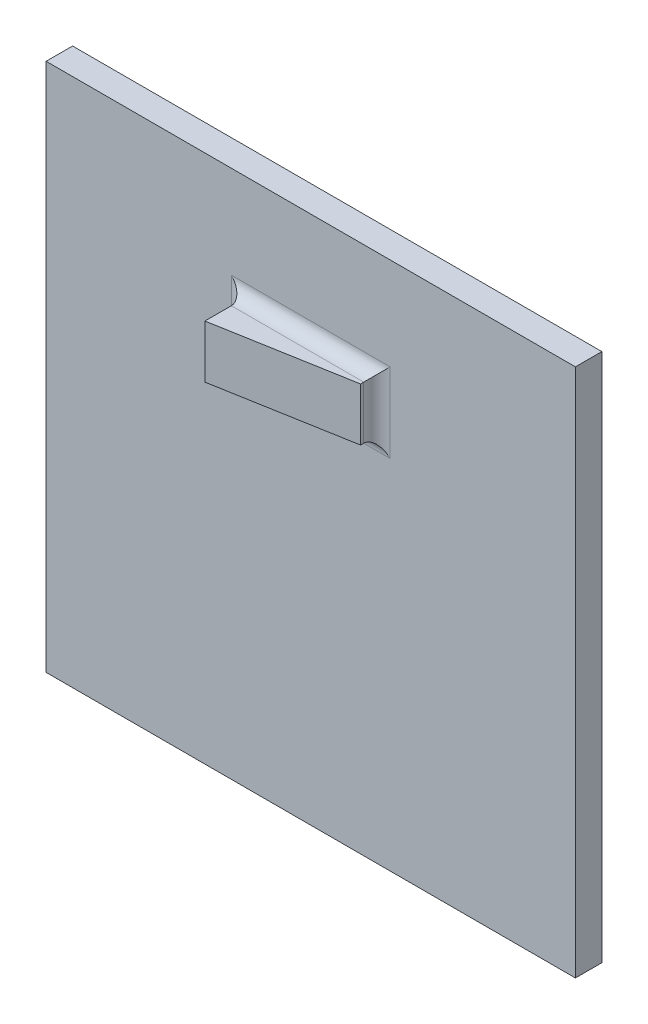
ISO-10303-21;
HEADER;
FILE_DESCRIPTION(('STEP AP214'),'2;1');
FILE_NAME('part.step','',(''),(''),'','','');
FILE_SCHEMA(('AUTOMOTIVE_DESIGN { 1 0 10303 214 1 1 1 1 }'));
ENDSEC;
DATA;
#1=APPLICATION_CONTEXT('core data for automotive mechanical design processes');
#2=APPLICATION_PROTOCOL_DEFINITION('international standard','automotive_design',2000,#1);
#3=PRODUCT_CONTEXT('',#1,'mechanical');
#4=PRODUCT('Part','Part','',(#3));
#5=PRODUCT_RELATED_PRODUCT_CATEGORY('part','',(#4));
#6=PRODUCT_DEFINITION_FORMATION('','',#4);
#7=PRODUCT_DEFINITION_CONTEXT('part definition',#1,'design');
#8=PRODUCT_DEFINITION('design','',#6,#7);
#9=PRODUCT_DEFINITION_SHAPE('','',#8);
#10=(LENGTH_UNIT() NAMED_UNIT(*) SI_UNIT(.MILLI.,.METRE.));
#11=(NAMED_UNIT(*) PLANE_ANGLE_UNIT() SI_UNIT($,.RADIAN.));
#12=(NAMED_UNIT(*) SI_UNIT($,.STERADIAN.) SOLID_ANGLE_UNIT());
#13=UNCERTAINTY_MEASURE_WITH_UNIT(LENGTH_MEASURE(1.E-05),#10,'distance_accuracy_value','');
#14=(GEOMETRIC_REPRESENTATION_CONTEXT(3) GLOBAL_UNCERTAINTY_ASSIGNED_CONTEXT((#13)) GLOBAL_UNIT_ASSIGNED_CONTEXT((#10,
#11,#12)) REPRESENTATION_CONTEXT('',''));
#15=CARTESIAN_POINT('',(0.,0.,0.));
#16=DIRECTION('',(0.,0.,1.));
#17=DIRECTION('',(1.,0.,0.));
#18=AXIS2_PLACEMENT_3D('',#15,#16,#17);
#19=CARTESIAN_POINT('',(20.,10.,2.));
#20=DIRECTION('',(-1.,0.,0.));
#21=DIRECTION('',(0.,-1.,0.));
#22=AXIS2_PLACEMENT_3D('',#19,#20,#21);
#23=PLANE('',#22);
#24=DIRECTION('',(0.,1.,0.));
#25=VECTOR('',#24,1.);
#26=CARTESIAN_POINT('',(20.,10.,0.));
#27=LINE('',#26,#25);
#28=CARTESIAN_POINT('',(20.,-30.,0.));
#29=VERTEX_POINT('',#28);
#30=CARTESIAN_POINT('',(20.,10.,0.));
#31=VERTEX_POINT('',#30);
#32=EDGE_CURVE('E141',#29,#31,#27,.T.);
#33=ORIENTED_EDGE('',*,*,#32,.T.);
#34=DIRECTION('',(0.,0.,-1.));
#35=VECTOR('',#34,1.);
#36=CARTESIAN_POINT('',(20.,10.,2.));
#37=LINE('',#36,#35);
#38=CARTESIAN_POINT('',(20.,10.,2.));
#39=VERTEX_POINT('',#38);
#40=EDGE_CURVE('E203',#39,#31,#37,.T.);
#41=ORIENTED_EDGE('',*,*,#40,.F.);
#42=DIRECTION('',(0.,1.,0.));
#43=VECTOR('',#42,1.);
#44=CARTESIAN_POINT('',(20.,10.,2.));
#45=LINE('',#44,#43);
#46=CARTESIAN_POINT('',(20.,-30.,2.));
#47=VERTEX_POINT('',#46);
#48=EDGE_CURVE('E134',#47,#39,#45,.T.);
#49=ORIENTED_EDGE('',*,*,#48,.F.);
#50=DIRECTION('',(0.,0.,1.));
#51=VECTOR('',#50,1.);
#52=CARTESIAN_POINT('',(20.,-30.,0.));
#53=LINE('',#52,#51);
#54=EDGE_CURVE('E146',#29,#47,#53,.T.);
#55=ORIENTED_EDGE('',*,*,#54,.F.);
#56=EDGE_LOOP('',(#33,#41,#49,#55));
#57=FACE_BOUND('',#56,.T.);
#58=ADVANCED_FACE('F42',(#57),#23,.F.);
#59=CARTESIAN_POINT('',(-20.,10.,2.));
#60=DIRECTION('',(0.,-1.,0.));
#61=DIRECTION('',(0.,0.,-1.));
#62=AXIS2_PLACEMENT_3D('',#59,#60,#61);
#63=PLANE('',#62);
#64=DIRECTION('',(-1.,0.,0.));
#65=VECTOR('',#64,1.);
#66=CARTESIAN_POINT('',(-20.,10.,0.));
#67=LINE('',#66,#65);
#68=CARTESIAN_POINT('',(-20.,10.,0.));
#69=VERTEX_POINT('',#68);
#70=EDGE_CURVE('E135',#31,#69,#67,.T.);
#71=ORIENTED_EDGE('',*,*,#70,.T.);
#72=DIRECTION('',(0.,0.,-1.));
#73=VECTOR('',#72,1.);
#74=CARTESIAN_POINT('',(-20.,10.,2.));
#75=LINE('',#74,#73);
#76=CARTESIAN_POINT('',(-20.,10.,2.));
#77=VERTEX_POINT('',#76);
#78=EDGE_CURVE('E131',#77,#69,#75,.T.);
#79=ORIENTED_EDGE('',*,*,#78,.F.);
#80=DIRECTION('',(-1.,0.,0.));
#81=VECTOR('',#80,1.);
#82=CARTESIAN_POINT('',(-20.,10.,2.));
#83=LINE('',#82,#81);
#84=EDGE_CURVE('E191',#39,#77,#83,.T.);
#85=ORIENTED_EDGE('',*,*,#84,.F.);
#86=ORIENTED_EDGE('',*,*,#40,.T.);
#87=EDGE_LOOP('',(#71,#79,#85,#86));
#88=FACE_BOUND('',#87,.T.);
#89=ADVANCED_FACE('F271',(#88),#63,.F.);
#90=CARTESIAN_POINT('',(-20.,10.,2.));
#91=DIRECTION('',(1.,0.,0.));
#92=DIRECTION('',(0.,1.,0.));
#93=AXIS2_PLACEMENT_3D('',#90,#91,#92);
#94=PLANE('',#93);
#95=DIRECTION('',(0.,-1.,0.));
#96=VECTOR('',#95,1.);
#97=CARTESIAN_POINT('',(-20.,10.,0.));
#98=LINE('',#97,#96);
#99=CARTESIAN_POINT('',(-20.,-30.,0.));
#100=VERTEX_POINT('',#99);
#101=EDGE_CURVE('E124',#69,#100,#98,.T.);
#102=ORIENTED_EDGE('',*,*,#101,.T.);
#103=DIRECTION('',(0.,0.,-1.));
#104=VECTOR('',#103,1.);
#105=CARTESIAN_POINT('',(-20.,-30.,2.));
#106=LINE('',#105,#104);
#107=CARTESIAN_POINT('',(-20.,-30.,2.));
#108=VERTEX_POINT('',#107);
#109=EDGE_CURVE('E129',#108,#100,#106,.T.);
#110=ORIENTED_EDGE('',*,*,#109,.F.);
#111=DIRECTION('',(0.,-1.,0.));
#112=VECTOR('',#111,1.);
#113=CARTESIAN_POINT('',(-20.,10.,2.));
#114=LINE('',#113,#112);
#115=EDGE_CURVE('E194',#77,#108,#114,.T.);
#116=ORIENTED_EDGE('',*,*,#115,.F.);
#117=ORIENTED_EDGE('',*,*,#78,.T.);
#118=EDGE_LOOP('',(#102,#110,#116,#117));
#119=FACE_BOUND('',#118,.T.);
#120=ADVANCED_FACE('F126',(#119),#94,.F.);
#121=CARTESIAN_POINT('',(0.,0.,2.));
#122=DIRECTION('',(0.,0.,1.));
#123=DIRECTION('',(1.,0.,0.));
#124=AXIS2_PLACEMENT_3D('',#121,#122,#123);
#125=PLANE('',#124);
#126=DIRECTION('',(-1.,0.,0.));
#127=VECTOR('',#126,1.);
#128=CARTESIAN_POINT('',(0.,3.,2.));
#129=LINE('',#128,#127);
#130=CARTESIAN_POINT('',(-6.,3.,2.));
#131=VERTEX_POINT('',#130);
#132=CARTESIAN_POINT('',(6.,3.,2.));
#133=VERTEX_POINT('',#132);
#134=EDGE_CURVE('E217',#131,#133,#129,.F.);
#135=ORIENTED_EDGE('',*,*,#134,.T.);
#136=DIRECTION('',(0.,1.,0.));
#137=VECTOR('',#136,1.);
#138=CARTESIAN_POINT('',(6.,0.,2.));
#139=LINE('',#138,#137);
#140=CARTESIAN_POINT('',(6.,-3.,2.));
#141=VERTEX_POINT('',#140);
#142=EDGE_CURVE('E220',#133,#141,#139,.F.);
#143=ORIENTED_EDGE('',*,*,#142,.T.);
#144=DIRECTION('',(1.,0.,0.));
#145=VECTOR('',#144,1.);
#146=CARTESIAN_POINT('',(0.,-3.,2.));
#147=LINE('',#146,#145);
#148=CARTESIAN_POINT('',(-6.,-3.,2.));
#149=VERTEX_POINT('',#148);
#150=EDGE_CURVE('E211',#141,#149,#147,.F.);
#151=ORIENTED_EDGE('',*,*,#150,.T.);
#152=DIRECTION('',(0.,-1.,0.));
#153=VECTOR('',#152,1.);
#154=CARTESIAN_POINT('',(-6.,0.,2.));
#155=LINE('',#154,#153);
#156=EDGE_CURVE('E214',#149,#131,#155,.F.);
#157=ORIENTED_EDGE('',*,*,#156,.T.);
#158=EDGE_LOOP('',(#135,#143,#151,#157));
#159=FACE_BOUND('',#158,.T.);
#160=ORIENTED_EDGE('',*,*,#48,.T.);
#161=ORIENTED_EDGE('',*,*,#84,.T.);
#162=ORIENTED_EDGE('',*,*,#115,.T.);
#163=DIRECTION('',(-1.,0.,0.));
#164=VECTOR('',#163,1.);
#165=CARTESIAN_POINT('',(20.,-30.,2.));
#166=LINE('',#165,#164);
#167=EDGE_CURVE('E151',#47,#108,#166,.T.);
#168=ORIENTED_EDGE('',*,*,#167,.F.);
#169=EDGE_LOOP('',(#160,#161,#162,#168));
#170=FACE_BOUND('',#169,.T.);
#171=ADVANCED_FACE('F337',(#159,#170),#125,.T.);
#172=CARTESIAN_POINT('',(0.,0.,0.));
#173=DIRECTION('',(0.,0.,1.));
#174=DIRECTION('',(1.,0.,0.));
#175=AXIS2_PLACEMENT_3D('',#172,#173,#174);
#176=PLANE('',#175);
#177=ORIENTED_EDGE('',*,*,#32,.F.);
#178=DIRECTION('',(1.,0.,0.));
#179=VECTOR('',#178,1.);
#180=CARTESIAN_POINT('',(-20.,-30.,0.));
#181=LINE('',#180,#179);
#182=EDGE_CURVE('E138',#100,#29,#181,.T.);
#183=ORIENTED_EDGE('',*,*,#182,.F.);
#184=ORIENTED_EDGE('',*,*,#101,.F.);
#185=ORIENTED_EDGE('',*,*,#70,.F.);
#186=EDGE_LOOP('',(#177,#183,#184,#185));
#187=FACE_BOUND('',#186,.T.);
#188=ADVANCED_FACE('F139',(#187),#176,.F.);
#189=CARTESIAN_POINT('',(5.,2.,5.));
#190=DIRECTION('',(-1.,0.,0.));
#191=DIRECTION('',(0.,-1.,0.));
#192=AXIS2_PLACEMENT_3D('',#189,#190,#191);
#193=PLANE('',#192);
#194=DIRECTION('',(0.,0.,-1.));
#195=VECTOR('',#194,1.);
#196=CARTESIAN_POINT('',(5.,-2.,5.));
#197=LINE('',#196,#195);
#198=CARTESIAN_POINT('',(5.,-2.,3.23673019291542));
#199=VERTEX_POINT('',#198);
#200=CARTESIAN_POINT('',(5.,-2.,3.));
#201=VERTEX_POINT('',#200);
#202=EDGE_CURVE('E175',#199,#201,#197,.T.);
#203=ORIENTED_EDGE('',*,*,#202,.T.);
#204=DIRECTION('',(0.,1.,0.));
#205=VECTOR('',#204,1.);
#206=CARTESIAN_POINT('',(5.,2.,3.));
#207=LINE('',#206,#205);
#208=CARTESIAN_POINT('',(5.,2.,3.));
#209=VERTEX_POINT('',#208);
#210=EDGE_CURVE('E207',#201,#209,#207,.T.);
#211=ORIENTED_EDGE('',*,*,#210,.T.);
#212=DIRECTION('',(0.,0.,-1.));
#213=VECTOR('',#212,1.);
#214=CARTESIAN_POINT('',(5.,2.,5.));
#215=LINE('',#214,#213);
#216=CARTESIAN_POINT('',(5.,2.,3.23673019291542));
#217=VERTEX_POINT('',#216);
#218=EDGE_CURVE('E185',#217,#209,#215,.T.);
#219=ORIENTED_EDGE('',*,*,#218,.F.);
#220=DIRECTION('',(0.,-1.,0.));
#221=VECTOR('',#220,1.);
#222=CARTESIAN_POINT('',(5.,10.001,3.23673019291542));
#223=LINE('',#222,#221);
#224=EDGE_CURVE('E165',#217,#199,#223,.T.);
#225=ORIENTED_EDGE('',*,*,#224,.T.);
#226=EDGE_LOOP('',(#203,#211,#219,#225));
#227=FACE_BOUND('',#226,.T.);
#228=ADVANCED_FACE('F254',(#227),#193,.F.);
#229=CARTESIAN_POINT('',(-5.,2.,5.));
#230=DIRECTION('',(0.,-1.,0.));
#231=DIRECTION('',(0.,0.,-1.));
#232=AXIS2_PLACEMENT_3D('',#229,#230,#231);
#233=PLANE('',#232);
#234=ORIENTED_EDGE('',*,*,#218,.T.);
#235=DIRECTION('',(-1.,0.,0.));
#236=VECTOR('',#235,1.);
#237=CARTESIAN_POINT('',(-5.,2.,3.));
#238=LINE('',#237,#236);
#239=CARTESIAN_POINT('',(-5.,2.,3.));
#240=VERTEX_POINT('',#239);
#241=EDGE_CURVE('E67',#209,#240,#238,.T.);
#242=ORIENTED_EDGE('',*,*,#241,.T.);
#243=DIRECTION('',(0.,0.,-1.));
#244=VECTOR('',#243,1.);
#245=CARTESIAN_POINT('',(-5.,2.,5.));
#246=LINE('',#245,#244);
#247=CARTESIAN_POINT('',(-5.,2.,5.));
#248=VERTEX_POINT('',#247);
#249=EDGE_CURVE('E182',#248,#240,#246,.T.);
#250=ORIENTED_EDGE('',*,*,#249,.F.);
#251=DIRECTION('',(-0.984807753012209,0.,0.173648177666923));
#252=VECTOR('',#251,1.);
#253=CARTESIAN_POINT('',(-5.,2.,5.));
#254=LINE('',#253,#252);
#255=EDGE_CURVE('E169',#217,#248,#254,.T.);
#256=ORIENTED_EDGE('',*,*,#255,.F.);
#257=EDGE_LOOP('',(#234,#242,#250,#256));
#258=FACE_BOUND('',#257,.T.);
#259=ADVANCED_FACE('F259',(#258),#233,.F.);
#260=CARTESIAN_POINT('',(-5.,2.,5.));
#261=DIRECTION('',(1.,0.,0.));
#262=DIRECTION('',(0.,0.,-1.));
#263=AXIS2_PLACEMENT_3D('',#260,#261,#262);
#264=PLANE('',#263);
#265=ORIENTED_EDGE('',*,*,#249,.T.);
#266=DIRECTION('',(0.,-1.,0.));
#267=VECTOR('',#266,1.);
#268=CARTESIAN_POINT('',(-5.,2.,3.));
#269=LINE('',#268,#267);
#270=CARTESIAN_POINT('',(-5.,-2.,3.));
#271=VERTEX_POINT('',#270);
#272=EDGE_CURVE('E52',#240,#271,#269,.T.);
#273=ORIENTED_EDGE('',*,*,#272,.T.);
#274=DIRECTION('',(0.,0.,-1.));
#275=VECTOR('',#274,1.);
#276=CARTESIAN_POINT('',(-5.,-2.,5.));
#277=LINE('',#276,#275);
#278=CARTESIAN_POINT('',(-5.,-2.,5.));
#279=VERTEX_POINT('',#278);
#280=EDGE_CURVE('E179',#279,#271,#277,.T.);
#281=ORIENTED_EDGE('',*,*,#280,.F.);
#282=DIRECTION('',(0.,-1.,0.));
#283=VECTOR('',#282,1.);
#284=CARTESIAN_POINT('',(-5.,2.,5.));
#285=LINE('',#284,#283);
#286=EDGE_CURVE('E172',#248,#279,#285,.T.);
#287=ORIENTED_EDGE('',*,*,#286,.F.);
#288=EDGE_LOOP('',(#265,#273,#281,#287));
#289=FACE_BOUND('',#288,.T.);
#290=ADVANCED_FACE('F261',(#289),#264,.F.);
#291=CARTESIAN_POINT('',(-5.,-2.,5.));
#292=DIRECTION('',(0.,1.,0.));
#293=DIRECTION('',(0.,0.,1.));
#294=AXIS2_PLACEMENT_3D('',#291,#292,#293);
#295=PLANE('',#294);
#296=ORIENTED_EDGE('',*,*,#280,.T.);
#297=DIRECTION('',(1.,0.,0.));
#298=VECTOR('',#297,1.);
#299=CARTESIAN_POINT('',(-5.,-2.,3.));
#300=LINE('',#299,#298);
#301=EDGE_CURVE('E11',#271,#201,#300,.T.);
#302=ORIENTED_EDGE('',*,*,#301,.T.);
#303=ORIENTED_EDGE('',*,*,#202,.F.);
#304=DIRECTION('',(0.984807753012209,0.,-0.173648177666923));
#305=VECTOR('',#304,1.);
#306=CARTESIAN_POINT('',(-5.,-2.,5.));
#307=LINE('',#306,#305);
#308=EDGE_CURVE('E162',#279,#199,#307,.T.);
#309=ORIENTED_EDGE('',*,*,#308,.F.);
#310=EDGE_LOOP('',(#296,#302,#303,#309));
#311=FACE_BOUND('',#310,.T.);
#312=ADVANCED_FACE('F251',(#311),#295,.F.);
#313=CARTESIAN_POINT('',(-5.,10.001,5.));
#314=DIRECTION('',(-0.173648177666923,0.,-0.984807753012209));
#315=DIRECTION('',(-0.984807753012209,0.,0.173648177666923));
#316=AXIS2_PLACEMENT_3D('',#313,#314,#315);
#317=PLANE('',#316);
#318=ORIENTED_EDGE('',*,*,#255,.T.);
#319=ORIENTED_EDGE('',*,*,#286,.T.);
#320=ORIENTED_EDGE('',*,*,#308,.T.);
#321=ORIENTED_EDGE('',*,*,#224,.F.);
#322=EDGE_LOOP('',(#318,#319,#320,#321));
#323=FACE_BOUND('',#322,.T.);
#324=ADVANCED_FACE('F258',(#323),#317,.F.);
#325=CARTESIAN_POINT('',(0.,-30.,0.));
#326=DIRECTION('',(0.,-1.,0.));
#327=DIRECTION('',(0.,0.,-1.));
#328=AXIS2_PLACEMENT_3D('',#325,#326,#327);
#329=PLANE('',#328);
#330=ORIENTED_EDGE('',*,*,#109,.T.);
#331=ORIENTED_EDGE('',*,*,#182,.T.);
#332=ORIENTED_EDGE('',*,*,#54,.T.);
#333=ORIENTED_EDGE('',*,*,#167,.T.);
#334=EDGE_LOOP('',(#330,#331,#332,#333));
#335=FACE_BOUND('',#334,.T.);
#336=ADVANCED_FACE('F149',(#335),#329,.T.);
#337=CARTESIAN_POINT('',(-6.,2.,3.));
#338=DIRECTION('',(0.,-1.,0.));
#339=DIRECTION('',(0.,0.,-1.));
#340=AXIS2_PLACEMENT_3D('',#337,#338,#339);
#341=CYLINDRICAL_SURFACE('',#340,1.);
#342=CARTESIAN_POINT('',(-6.,3.,3.));
#343=DIRECTION('',(-0.707106781186547,-0.707106781186547,0.));
#344=DIRECTION('',(0.707106781186547,-0.707106781186547,0.));
#345=AXIS2_PLACEMENT_3D('',#342,#343,#344);
#346=ELLIPSE('',#345,1.41421356237309,1.);
#347=EDGE_CURVE('E156',#131,#240,#346,.T.);
#348=ORIENTED_EDGE('',*,*,#347,.F.);
#349=ORIENTED_EDGE('',*,*,#156,.F.);
#350=CARTESIAN_POINT('',(-6.,-3.,3.));
#351=DIRECTION('',(0.707106781186547,-0.707106781186547,0.));
#352=DIRECTION('',(0.707106781186547,0.707106781186547,0.));
#353=AXIS2_PLACEMENT_3D('',#350,#351,#352);
#354=ELLIPSE('',#353,1.41421356237309,1.);
#355=EDGE_CURVE('E46',#271,#149,#354,.F.);
#356=ORIENTED_EDGE('',*,*,#355,.F.);
#357=ORIENTED_EDGE('',*,*,#272,.F.);
#358=EDGE_LOOP('',(#348,#349,#356,#357));
#359=FACE_BOUND('',#358,.T.);
#360=ADVANCED_FACE('F44',(#359),#341,.F.);
#361=CARTESIAN_POINT('',(-5.,-3.,3.));
#362=DIRECTION('',(1.,0.,0.));
#363=DIRECTION('',(0.,0.,-1.));
#364=AXIS2_PLACEMENT_3D('',#361,#362,#363);
#365=CYLINDRICAL_SURFACE('',#364,1.);
#366=ORIENTED_EDGE('',*,*,#355,.T.);
#367=ORIENTED_EDGE('',*,*,#150,.F.);
#368=CARTESIAN_POINT('',(6.,-3.,3.));
#369=DIRECTION('',(0.707106781186547,0.707106781186548,0.));
#370=DIRECTION('',(0.707106781186548,-0.707106781186547,0.));
#371=AXIS2_PLACEMENT_3D('',#368,#369,#370);
#372=ELLIPSE('',#371,1.4142135623731,1.);
#373=EDGE_CURVE('E231',#201,#141,#372,.F.);
#374=ORIENTED_EDGE('',*,*,#373,.F.);
#375=ORIENTED_EDGE('',*,*,#301,.F.);
#376=EDGE_LOOP('',(#366,#367,#374,#375));
#377=FACE_BOUND('',#376,.T.);
#378=ADVANCED_FACE('F247',(#377),#365,.F.);
#379=CARTESIAN_POINT('',(-5.,3.,3.));
#380=DIRECTION('',(-1.,0.,0.));
#381=DIRECTION('',(0.,0.,1.));
#382=AXIS2_PLACEMENT_3D('',#379,#380,#381);
#383=CYLINDRICAL_SURFACE('',#382,1.);
#384=ORIENTED_EDGE('',*,*,#347,.T.);
#385=ORIENTED_EDGE('',*,*,#241,.F.);
#386=CARTESIAN_POINT('',(6.,3.,3.));
#387=DIRECTION('',(-0.707106781186548,0.707106781186547,0.));
#388=DIRECTION('',(-0.707106781186547,-0.707106781186548,0.));
#389=AXIS2_PLACEMENT_3D('',#386,#387,#388);
#390=ELLIPSE('',#389,1.41421356237309,1.);
#391=EDGE_CURVE('E228',#133,#209,#390,.T.);
#392=ORIENTED_EDGE('',*,*,#391,.F.);
#393=ORIENTED_EDGE('',*,*,#134,.F.);
#394=EDGE_LOOP('',(#384,#385,#392,#393));
#395=FACE_BOUND('',#394,.T.);
#396=ADVANCED_FACE('F238',(#395),#383,.F.);
#397=CARTESIAN_POINT('',(6.,2.,3.));
#398=DIRECTION('',(0.,1.,0.));
#399=DIRECTION('',(-1.,0.,0.));
#400=AXIS2_PLACEMENT_3D('',#397,#398,#399);
#401=CYLINDRICAL_SURFACE('',#400,1.);
#402=ORIENTED_EDGE('',*,*,#373,.T.);
#403=ORIENTED_EDGE('',*,*,#142,.F.);
#404=ORIENTED_EDGE('',*,*,#391,.T.);
#405=ORIENTED_EDGE('',*,*,#210,.F.);
#406=EDGE_LOOP('',(#402,#403,#404,#405));
#407=FACE_BOUND('',#406,.T.);
#408=ADVANCED_FACE('F281',(#407),#401,.F.);
#409=CLOSED_SHELL('',(#58,#89,#120,#171,#188,#228,#259,#290,#312,#324,#336,#360,#378,#396,#408));
#410=MANIFOLD_SOLID_BREP('B2',#409);
#411=ADVANCED_BREP_SHAPE_REPRESENTATION('',(#18,#410),#14);
#412=SHAPE_DEFINITION_REPRESENTATION(#9,#411);
ENDSEC;
END-ISO-10303-21;
